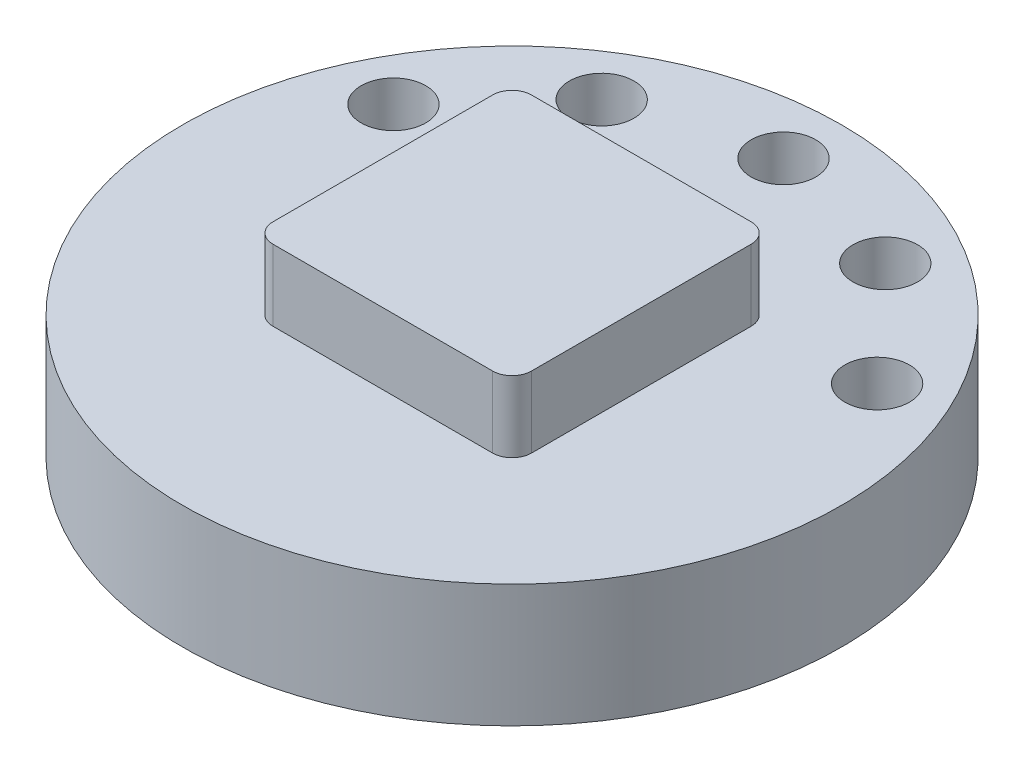
ISO-10303-21;
HEADER;
FILE_DESCRIPTION(('STEP AP214'),'2;1');
FILE_NAME('part.step','',(''),(''),'','','');
FILE_SCHEMA(('AUTOMOTIVE_DESIGN { 1 0 10303 214 1 1 1 1 }'));
ENDSEC;
DATA;
#1=APPLICATION_CONTEXT('core data for automotive mechanical design processes');
#2=APPLICATION_PROTOCOL_DEFINITION('international standard','automotive_design',2000,#1);
#3=PRODUCT_CONTEXT('',#1,'mechanical');
#4=PRODUCT('Part','Part','',(#3));
#5=PRODUCT_RELATED_PRODUCT_CATEGORY('part','',(#4));
#6=PRODUCT_DEFINITION_FORMATION('','',#4);
#7=PRODUCT_DEFINITION_CONTEXT('part definition',#1,'design');
#8=PRODUCT_DEFINITION('design','',#6,#7);
#9=PRODUCT_DEFINITION_SHAPE('','',#8);
#10=(LENGTH_UNIT() NAMED_UNIT(*) SI_UNIT(.MILLI.,.METRE.));
#11=(NAMED_UNIT(*) PLANE_ANGLE_UNIT() SI_UNIT($,.RADIAN.));
#12=(NAMED_UNIT(*) SI_UNIT($,.STERADIAN.) SOLID_ANGLE_UNIT());
#13=UNCERTAINTY_MEASURE_WITH_UNIT(LENGTH_MEASURE(1.E-05),#10,'distance_accuracy_value','');
#14=(GEOMETRIC_REPRESENTATION_CONTEXT(3) GLOBAL_UNCERTAINTY_ASSIGNED_CONTEXT((#13)) GLOBAL_UNIT_ASSIGNED_CONTEXT((#10,
#11,#12)) REPRESENTATION_CONTEXT('',''));
#15=CARTESIAN_POINT('',(0.,0.,0.));
#16=DIRECTION('',(0.,0.,1.));
#17=DIRECTION('',(1.,0.,0.));
#18=AXIS2_PLACEMENT_3D('',#15,#16,#17);
#19=CARTESIAN_POINT('',(0.,1.9,0.));
#20=DIRECTION('',(0.,1.,0.));
#21=DIRECTION('',(0.,0.,1.));
#22=AXIS2_PLACEMENT_3D('',#19,#20,#21);
#23=PLANE('',#22);
#24=CARTESIAN_POINT('',(-3.74222740159116,1.9,-1.90676009890607));
#25=DIRECTION('',(0.,1.,0.));
#26=DIRECTION('',(0.,0.,-1.));
#27=AXIS2_PLACEMENT_3D('',#24,#25,#26);
#28=CIRCLE('',#27,0.5);
#29=CARTESIAN_POINT('',(-3.74222740159116,1.9,-2.40676009890607));
#30=VERTEX_POINT('',#29);
#31=EDGE_CURVE('E139',#30,#30,#28,.T.);
#32=ORIENTED_EDGE('',*,*,#31,.F.);
#33=EDGE_LOOP('',(#32));
#34=FACE_BOUND('',#33,.T.);
#35=CARTESIAN_POINT('',(2.194493971807,1.9,-3.58108869028718));
#36=DIRECTION('',(0.,1.,0.));
#37=DIRECTION('',(0.,0.,1.));
#38=AXIS2_PLACEMENT_3D('',#35,#36,#37);
#39=CIRCLE('',#38,0.5);
#40=CARTESIAN_POINT('',(2.194493971807,1.9,-3.08108869028718));
#41=VERTEX_POINT('',#40);
#42=EDGE_CURVE('E151',#41,#41,#39,.T.);
#43=ORIENTED_EDGE('',*,*,#42,.F.);
#44=EDGE_LOOP('',(#43));
#45=FACE_BOUND('',#44,.T.);
#46=CARTESIAN_POINT('',(0.,1.9,0.));
#47=DIRECTION('',(0.,1.,0.));
#48=DIRECTION('',(0.,0.,1.));
#49=AXIS2_PLACEMENT_3D('',#46,#47,#48);
#50=CIRCLE('',#49,5.1);
#51=CARTESIAN_POINT('',(0.,1.9,-5.1));
#52=VERTEX_POINT('',#51);
#53=EDGE_CURVE('E163',#52,#52,#50,.T.);
#54=ORIENTED_EDGE('',*,*,#53,.T.);
#55=EDGE_LOOP('',(#54));
#56=FACE_BOUND('',#55,.T.);
#57=CARTESIAN_POINT('',(0.,1.9,-4.2));
#58=DIRECTION('',(0.,1.,0.));
#59=DIRECTION('',(0.,0.,1.));
#60=AXIS2_PLACEMENT_3D('',#57,#58,#59);
#61=CIRCLE('',#60,0.5);
#62=CARTESIAN_POINT('',(0.,1.9,-3.7));
#63=VERTEX_POINT('',#62);
#64=EDGE_CURVE('E157',#63,#63,#61,.T.);
#65=ORIENTED_EDGE('',*,*,#64,.F.);
#66=EDGE_LOOP('',(#65));
#67=FACE_BOUND('',#66,.T.);
#68=CARTESIAN_POINT('',(3.74222740159116,1.9,-1.90676009890607));
#69=DIRECTION('',(0.,1.,0.));
#70=DIRECTION('',(0.,0.,1.));
#71=AXIS2_PLACEMENT_3D('',#68,#69,#70);
#72=CIRCLE('',#71,0.5);
#73=CARTESIAN_POINT('',(3.74222740159116,1.9,-1.40676009890607));
#74=VERTEX_POINT('',#73);
#75=EDGE_CURVE('E145',#74,#74,#72,.T.);
#76=ORIENTED_EDGE('',*,*,#75,.F.);
#77=EDGE_LOOP('',(#76));
#78=FACE_BOUND('',#77,.T.);
#79=CARTESIAN_POINT('',(-2.194493971807,1.9,-3.58108869028718));
#80=DIRECTION('',(0.,1.,0.));
#81=DIRECTION('',(0.,0.,-1.));
#82=AXIS2_PLACEMENT_3D('',#79,#80,#81);
#83=CIRCLE('',#82,0.5);
#84=CARTESIAN_POINT('',(-2.194493971807,1.9,-4.08108869028718));
#85=VERTEX_POINT('',#84);
#86=EDGE_CURVE('E132',#85,#85,#83,.T.);
#87=ORIENTED_EDGE('',*,*,#86,.F.);
#88=EDGE_LOOP('',(#87));
#89=FACE_BOUND('',#88,.T.);
#90=DIRECTION('',(-1.,0.,0.));
#91=VECTOR('',#90,1.);
#92=CARTESIAN_POINT('',(-2.,1.9,-2.));
#93=LINE('',#92,#91);
#94=CARTESIAN_POINT('',(1.7,1.9,-2.));
#95=VERTEX_POINT('',#94);
#96=CARTESIAN_POINT('',(-1.7,1.9,-2.));
#97=VERTEX_POINT('',#96);
#98=EDGE_CURVE('E128',#95,#97,#93,.T.);
#99=ORIENTED_EDGE('',*,*,#98,.F.);
#100=CARTESIAN_POINT('',(1.7,1.9,-1.7));
#101=DIRECTION('',(0.,1.,0.));
#102=DIRECTION('',(0.,0.,1.));
#103=AXIS2_PLACEMENT_3D('',#100,#101,#102);
#104=CIRCLE('',#103,0.3);
#105=CARTESIAN_POINT('',(2.,1.9,-1.7));
#106=VERTEX_POINT('',#105);
#107=EDGE_CURVE('E43',#95,#106,#104,.F.);
#108=ORIENTED_EDGE('',*,*,#107,.T.);
#109=DIRECTION('',(0.,0.,-1.));
#110=VECTOR('',#109,1.);
#111=CARTESIAN_POINT('',(2.,1.9,2.));
#112=LINE('',#111,#110);
#113=CARTESIAN_POINT('',(2.,1.9,1.7));
#114=VERTEX_POINT('',#113);
#115=EDGE_CURVE('E189',#114,#106,#112,.T.);
#116=ORIENTED_EDGE('',*,*,#115,.F.);
#117=CARTESIAN_POINT('',(1.7,1.9,1.7));
#118=DIRECTION('',(0.,1.,0.));
#119=DIRECTION('',(0.,0.,1.));
#120=AXIS2_PLACEMENT_3D('',#117,#118,#119);
#121=CIRCLE('',#120,0.3);
#122=CARTESIAN_POINT('',(1.7,1.9,2.));
#123=VERTEX_POINT('',#122);
#124=EDGE_CURVE('E107',#114,#123,#121,.F.);
#125=ORIENTED_EDGE('',*,*,#124,.T.);
#126=DIRECTION('',(1.,0.,0.));
#127=VECTOR('',#126,1.);
#128=CARTESIAN_POINT('',(-2.,1.9,2.));
#129=LINE('',#128,#127);
#130=CARTESIAN_POINT('',(-1.7,1.9,2.));
#131=VERTEX_POINT('',#130);
#132=EDGE_CURVE('E114',#131,#123,#129,.T.);
#133=ORIENTED_EDGE('',*,*,#132,.F.);
#134=CARTESIAN_POINT('',(-1.7,1.9,1.7));
#135=DIRECTION('',(0.,1.,0.));
#136=DIRECTION('',(0.,0.,1.));
#137=AXIS2_PLACEMENT_3D('',#134,#135,#136);
#138=CIRCLE('',#137,0.3);
#139=CARTESIAN_POINT('',(-2.,1.9,1.7));
#140=VERTEX_POINT('',#139);
#141=EDGE_CURVE('E99',#131,#140,#138,.F.);
#142=ORIENTED_EDGE('',*,*,#141,.T.);
#143=DIRECTION('',(0.,0.,1.));
#144=VECTOR('',#143,1.);
#145=CARTESIAN_POINT('',(-2.,1.9,2.));
#146=LINE('',#145,#144);
#147=CARTESIAN_POINT('',(-2.,1.9,-1.7));
#148=VERTEX_POINT('',#147);
#149=EDGE_CURVE('E123',#148,#140,#146,.T.);
#150=ORIENTED_EDGE('',*,*,#149,.F.);
#151=CARTESIAN_POINT('',(-1.7,1.9,-1.7));
#152=DIRECTION('',(0.,1.,0.));
#153=DIRECTION('',(0.,0.,1.));
#154=AXIS2_PLACEMENT_3D('',#151,#152,#153);
#155=CIRCLE('',#154,0.3);
#156=EDGE_CURVE('E11',#148,#97,#155,.F.);
#157=ORIENTED_EDGE('',*,*,#156,.T.);
#158=EDGE_LOOP('',(#99,#108,#116,#125,#133,#142,#150,#157));
#159=FACE_BOUND('',#158,.T.);
#160=ADVANCED_FACE('F35',(#34,#45,#56,#67,#78,#89,#159),#23,.T.);
#161=CARTESIAN_POINT('',(0.,0.,0.));
#162=DIRECTION('',(0.,1.,0.));
#163=DIRECTION('',(0.,0.,1.));
#164=AXIS2_PLACEMENT_3D('',#161,#162,#163);
#165=PLANE('',#164);
#166=CARTESIAN_POINT('',(0.,0.,0.));
#167=DIRECTION('',(0.,1.,0.));
#168=DIRECTION('',(0.,0.,1.));
#169=AXIS2_PLACEMENT_3D('',#166,#167,#168);
#170=CIRCLE('',#169,5.1);
#171=CARTESIAN_POINT('',(0.,0.,-5.1));
#172=VERTEX_POINT('',#171);
#173=EDGE_CURVE('E160',#172,#172,#170,.T.);
#174=ORIENTED_EDGE('',*,*,#173,.F.);
#175=EDGE_LOOP('',(#174));
#176=FACE_BOUND('',#175,.T.);
#177=CARTESIAN_POINT('',(0.,0.,-4.2));
#178=DIRECTION('',(0.,1.,0.));
#179=DIRECTION('',(0.,0.,1.));
#180=AXIS2_PLACEMENT_3D('',#177,#178,#179);
#181=CIRCLE('',#180,0.5);
#182=CARTESIAN_POINT('',(0.,0.,-3.7));
#183=VERTEX_POINT('',#182);
#184=EDGE_CURVE('E154',#183,#183,#181,.T.);
#185=ORIENTED_EDGE('',*,*,#184,.T.);
#186=EDGE_LOOP('',(#185));
#187=FACE_BOUND('',#186,.T.);
#188=CARTESIAN_POINT('',(2.194493971807,0.,-3.58108869028718));
#189=DIRECTION('',(0.,1.,0.));
#190=DIRECTION('',(0.,0.,1.));
#191=AXIS2_PLACEMENT_3D('',#188,#189,#190);
#192=CIRCLE('',#191,0.5);
#193=CARTESIAN_POINT('',(2.194493971807,0.,-3.08108869028718));
#194=VERTEX_POINT('',#193);
#195=EDGE_CURVE('E148',#194,#194,#192,.T.);
#196=ORIENTED_EDGE('',*,*,#195,.T.);
#197=EDGE_LOOP('',(#196));
#198=FACE_BOUND('',#197,.T.);
#199=CARTESIAN_POINT('',(3.74222740159116,0.,-1.90676009890607));
#200=DIRECTION('',(0.,1.,0.));
#201=DIRECTION('',(0.,0.,1.));
#202=AXIS2_PLACEMENT_3D('',#199,#200,#201);
#203=CIRCLE('',#202,0.5);
#204=CARTESIAN_POINT('',(3.74222740159116,0.,-1.40676009890607));
#205=VERTEX_POINT('',#204);
#206=EDGE_CURVE('E142',#205,#205,#203,.T.);
#207=ORIENTED_EDGE('',*,*,#206,.T.);
#208=EDGE_LOOP('',(#207));
#209=FACE_BOUND('',#208,.T.);
#210=CARTESIAN_POINT('',(-3.74222740159116,0.,-1.90676009890607));
#211=DIRECTION('',(0.,1.,0.));
#212=DIRECTION('',(0.,0.,-1.));
#213=AXIS2_PLACEMENT_3D('',#210,#211,#212);
#214=CIRCLE('',#213,0.5);
#215=CARTESIAN_POINT('',(-3.74222740159116,0.,-2.40676009890607));
#216=VERTEX_POINT('',#215);
#217=EDGE_CURVE('E135',#216,#216,#214,.T.);
#218=ORIENTED_EDGE('',*,*,#217,.T.);
#219=EDGE_LOOP('',(#218));
#220=FACE_BOUND('',#219,.T.);
#221=CARTESIAN_POINT('',(-2.194493971807,0.,-3.58108869028718));
#222=DIRECTION('',(0.,1.,0.));
#223=DIRECTION('',(0.,0.,-1.));
#224=AXIS2_PLACEMENT_3D('',#221,#222,#223);
#225=CIRCLE('',#224,0.5);
#226=CARTESIAN_POINT('',(-2.194493971807,0.,-4.08108869028718));
#227=VERTEX_POINT('',#226);
#228=EDGE_CURVE('E136',#227,#227,#225,.T.);
#229=ORIENTED_EDGE('',*,*,#228,.T.);
#230=EDGE_LOOP('',(#229));
#231=FACE_BOUND('',#230,.T.);
#232=ADVANCED_FACE('F224',(#176,#187,#198,#209,#220,#231),#165,.F.);
#233=CARTESIAN_POINT('',(0.,1.9,0.));
#234=DIRECTION('',(0.,-1.,0.));
#235=DIRECTION('',(0.,0.,-1.));
#236=AXIS2_PLACEMENT_3D('',#233,#234,#235);
#237=CYLINDRICAL_SURFACE('',#236,5.1);
#238=CARTESIAN_POINT('',(0.,1.9,-5.1));
#239=CARTESIAN_POINT('',(0.,1.88020833333333,-5.1));
#240=CARTESIAN_POINT('',(0.,1.86041666666667,-5.1));
#241=CARTESIAN_POINT('',(0.,1.82083333333333,-5.1));
#242=CARTESIAN_POINT('',(0.,1.80104166666667,-5.1));
#243=CARTESIAN_POINT('',(0.,1.76145833333333,-5.1));
#244=CARTESIAN_POINT('',(0.,1.74166666666667,-5.1));
#245=CARTESIAN_POINT('',(0.,1.70208333333333,-5.1));
#246=CARTESIAN_POINT('',(0.,1.68229166666667,-5.1));
#247=CARTESIAN_POINT('',(0.,1.64270833333333,-5.1));
#248=CARTESIAN_POINT('',(0.,1.62291666666667,-5.1));
#249=CARTESIAN_POINT('',(0.,1.58333333333333,-5.1));
#250=CARTESIAN_POINT('',(0.,1.56354166666667,-5.1));
#251=CARTESIAN_POINT('',(0.,1.52395833333333,-5.1));
#252=CARTESIAN_POINT('',(0.,1.50416666666667,-5.1));
#253=CARTESIAN_POINT('',(0.,1.46458333333333,-5.1));
#254=CARTESIAN_POINT('',(0.,1.44479166666667,-5.1));
#255=CARTESIAN_POINT('',(0.,1.40520833333333,-5.1));
#256=CARTESIAN_POINT('',(0.,1.38541666666667,-5.1));
#257=CARTESIAN_POINT('',(0.,1.34583333333333,-5.1));
#258=CARTESIAN_POINT('',(0.,1.32604166666667,-5.1));
#259=CARTESIAN_POINT('',(0.,1.28645833333333,-5.1));
#260=CARTESIAN_POINT('',(0.,1.26666666666667,-5.1));
#261=CARTESIAN_POINT('',(0.,1.22708333333333,-5.1));
#262=CARTESIAN_POINT('',(0.,1.20729166666667,-5.1));
#263=CARTESIAN_POINT('',(0.,1.16770833333333,-5.1));
#264=CARTESIAN_POINT('',(0.,1.14791666666667,-5.1));
#265=CARTESIAN_POINT('',(0.,1.10833333333333,-5.1));
#266=CARTESIAN_POINT('',(0.,1.08854166666667,-5.1));
#267=CARTESIAN_POINT('',(0.,1.04895833333333,-5.1));
#268=CARTESIAN_POINT('',(0.,1.02916666666667,-5.1));
#269=CARTESIAN_POINT('',(0.,0.989583333333333,-5.1));
#270=CARTESIAN_POINT('',(0.,0.969791666666666,-5.1));
#271=CARTESIAN_POINT('',(0.,0.930208333333333,-5.1));
#272=CARTESIAN_POINT('',(0.,0.910416666666667,-5.1));
#273=CARTESIAN_POINT('',(0.,0.870833333333333,-5.1));
#274=CARTESIAN_POINT('',(0.,0.851041666666667,-5.1));
#275=CARTESIAN_POINT('',(0.,0.811458333333333,-5.1));
#276=CARTESIAN_POINT('',(0.,0.791666666666667,-5.1));
#277=CARTESIAN_POINT('',(0.,0.752083333333333,-5.1));
#278=CARTESIAN_POINT('',(0.,0.732291666666667,-5.1));
#279=CARTESIAN_POINT('',(0.,0.692708333333333,-5.1));
#280=CARTESIAN_POINT('',(0.,0.672916666666667,-5.1));
#281=CARTESIAN_POINT('',(0.,0.633333333333333,-5.1));
#282=CARTESIAN_POINT('',(0.,0.613541666666667,-5.1));
#283=CARTESIAN_POINT('',(0.,0.573958333333333,-5.1));
#284=CARTESIAN_POINT('',(0.,0.554166666666667,-5.1));
#285=CARTESIAN_POINT('',(0.,0.514583333333334,-5.1));
#286=CARTESIAN_POINT('',(0.,0.494791666666667,-5.1));
#287=CARTESIAN_POINT('',(0.,0.455208333333333,-5.1));
#288=CARTESIAN_POINT('',(0.,0.435416666666667,-5.1));
#289=CARTESIAN_POINT('',(0.,0.395833333333333,-5.1));
#290=CARTESIAN_POINT('',(0.,0.376041666666667,-5.1));
#291=CARTESIAN_POINT('',(0.,0.336458333333333,-5.1));
#292=CARTESIAN_POINT('',(0.,0.316666666666667,-5.1));
#293=CARTESIAN_POINT('',(0.,0.277083333333333,-5.1));
#294=CARTESIAN_POINT('',(0.,0.257291666666667,-5.1));
#295=CARTESIAN_POINT('',(0.,0.217708333333333,-5.1));
#296=CARTESIAN_POINT('',(0.,0.197916666666667,-5.1));
#297=CARTESIAN_POINT('',(0.,0.158333333333333,-5.1));
#298=CARTESIAN_POINT('',(0.,0.138541666666667,-5.1));
#299=CARTESIAN_POINT('',(0.,0.0989583333333333,-5.1));
#300=CARTESIAN_POINT('',(0.,0.0791666666666666,-5.1));
#301=CARTESIAN_POINT('',(0.,0.0395833333333333,-5.1));
#302=CARTESIAN_POINT('',(0.,0.0197916666666666,-5.1));
#303=CARTESIAN_POINT('',(0.,0.,-5.1));
#304=B_SPLINE_CURVE_WITH_KNOTS('',3,(#238,#239,#240,#241,#242,#243,#244,#245,#246,#247,#248,
#249,#250,#251,#252,#253,#254,#255,#256,#257,#258,#259,#260,#261,#262,#263,#264,#265,#266,#267,
#268,#269,#270,#271,#272,#273,#274,#275,#276,#277,#278,#279,#280,#281,#282,#283,#284,#285,#286,
#287,#288,#289,#290,#291,#292,#293,#294,#295,#296,#297,#298,#299,#300,#301,#302,#303),
.UNSPECIFIED.,.F.,.F.,(4,2,2,2,2,2,2,2,2,2,2,2,2,2,2,2,2,2,2,2,2,2,2,2,2,2,2,2,2,2,2,2,4),(0.,
0.0593750000000002,0.11875,0.178125,0.2375,0.296875,0.35625,0.415625,0.475,0.534375,0.59375,
0.653125,0.7125,0.771875,0.83125,0.890625,0.95,1.009375,1.06875,1.128125,1.1875,1.246875,
1.30625,1.365625,1.425,1.484375,1.54375,1.603125,1.6625,1.721875,1.78125,1.840625,1.9),.UNSPECIFIED.);
#305=EDGE_CURVE('BSEAM230',#52,#172,#304,.T.);
#306=ORIENTED_EDGE('',*,*,#53,.F.);
#307=ORIENTED_EDGE('',*,*,#173,.T.);
#308=ORIENTED_EDGE('',*,*,#305,.T.);
#309=ORIENTED_EDGE('',*,*,#305,.F.);
#310=EDGE_LOOP('',(#306,#308,#307,#309));
#311=FACE_BOUND('',#310,.T.);
#312=ADVANCED_FACE('F230',(#311),#237,.T.);
#313=CARTESIAN_POINT('',(0.,1.9,-4.2));
#314=DIRECTION('',(0.,-1.,0.));
#315=DIRECTION('',(0.,0.,-1.));
#316=AXIS2_PLACEMENT_3D('',#313,#314,#315);
#317=CYLINDRICAL_SURFACE('',#316,0.5);
#318=ORIENTED_EDGE('',*,*,#64,.T.);
#319=EDGE_LOOP('',(#318));
#320=FACE_BOUND('',#319,.T.);
#321=ORIENTED_EDGE('',*,*,#184,.F.);
#322=EDGE_LOOP('',(#321));
#323=FACE_BOUND('',#322,.T.);
#324=ADVANCED_FACE('F236',(#320,#323),#317,.F.);
#325=CARTESIAN_POINT('',(2.194493971807,1.9,-3.58108869028718));
#326=DIRECTION('',(0.,-1.,0.));
#327=DIRECTION('',(0.,0.,-1.));
#328=AXIS2_PLACEMENT_3D('',#325,#326,#327);
#329=CYLINDRICAL_SURFACE('',#328,0.5);
#330=ORIENTED_EDGE('',*,*,#42,.T.);
#331=EDGE_LOOP('',(#330));
#332=FACE_BOUND('',#331,.T.);
#333=ORIENTED_EDGE('',*,*,#195,.F.);
#334=EDGE_LOOP('',(#333));
#335=FACE_BOUND('',#334,.T.);
#336=ADVANCED_FACE('F336',(#332,#335),#329,.F.);
#337=CARTESIAN_POINT('',(3.74222740159116,1.9,-1.90676009890607));
#338=DIRECTION('',(0.,-1.,0.));
#339=DIRECTION('',(0.,0.,-1.));
#340=AXIS2_PLACEMENT_3D('',#337,#338,#339);
#341=CYLINDRICAL_SURFACE('',#340,0.5);
#342=ORIENTED_EDGE('',*,*,#75,.T.);
#343=EDGE_LOOP('',(#342));
#344=FACE_BOUND('',#343,.T.);
#345=ORIENTED_EDGE('',*,*,#206,.F.);
#346=EDGE_LOOP('',(#345));
#347=FACE_BOUND('',#346,.T.);
#348=ADVANCED_FACE('F326',(#344,#347),#341,.F.);
#349=CARTESIAN_POINT('',(-3.74222740159116,1.9,-1.90676009890607));
#350=DIRECTION('',(0.,-1.,0.));
#351=DIRECTION('',(0.,0.,-1.));
#352=AXIS2_PLACEMENT_3D('',#349,#350,#351);
#353=CYLINDRICAL_SURFACE('',#352,0.5);
#354=ORIENTED_EDGE('',*,*,#31,.T.);
#355=EDGE_LOOP('',(#354));
#356=FACE_BOUND('',#355,.T.);
#357=ORIENTED_EDGE('',*,*,#217,.F.);
#358=EDGE_LOOP('',(#357));
#359=FACE_BOUND('',#358,.T.);
#360=ADVANCED_FACE('F316',(#356,#359),#353,.F.);
#361=CARTESIAN_POINT('',(-2.194493971807,1.9,-3.58108869028718));
#362=DIRECTION('',(0.,-1.,0.));
#363=DIRECTION('',(0.,0.,-1.));
#364=AXIS2_PLACEMENT_3D('',#361,#362,#363);
#365=CYLINDRICAL_SURFACE('',#364,0.5);
#366=ORIENTED_EDGE('',*,*,#86,.T.);
#367=EDGE_LOOP('',(#366));
#368=FACE_BOUND('',#367,.T.);
#369=ORIENTED_EDGE('',*,*,#228,.F.);
#370=EDGE_LOOP('',(#369));
#371=FACE_BOUND('',#370,.T.);
#372=ADVANCED_FACE('F302',(#368,#371),#365,.F.);
#373=CARTESIAN_POINT('',(2.,3.,2.));
#374=DIRECTION('',(-1.,0.,0.));
#375=DIRECTION('',(0.,0.,1.));
#376=AXIS2_PLACEMENT_3D('',#373,#374,#375);
#377=PLANE('',#376);
#378=DIRECTION('',(0.,0.,-1.));
#379=VECTOR('',#378,1.);
#380=CARTESIAN_POINT('',(2.,3.,2.));
#381=LINE('',#380,#379);
#382=CARTESIAN_POINT('',(2.,3.,1.7));
#383=VERTEX_POINT('',#382);
#384=CARTESIAN_POINT('',(2.,3.,-1.7));
#385=VERTEX_POINT('',#384);
#386=EDGE_CURVE('E122',#383,#385,#381,.T.);
#387=ORIENTED_EDGE('',*,*,#386,.F.);
#388=DIRECTION('',(0.,-1.,0.));
#389=VECTOR('',#388,1.);
#390=CARTESIAN_POINT('',(2.,3.,1.7));
#391=LINE('',#390,#389);
#392=EDGE_CURVE('E182',#383,#114,#391,.T.);
#393=ORIENTED_EDGE('',*,*,#392,.T.);
#394=ORIENTED_EDGE('',*,*,#115,.T.);
#395=DIRECTION('',(0.,-1.,0.));
#396=VECTOR('',#395,1.);
#397=CARTESIAN_POINT('',(2.,3.,-1.7));
#398=LINE('',#397,#396);
#399=EDGE_CURVE('E180',#106,#385,#398,.F.);
#400=ORIENTED_EDGE('',*,*,#399,.T.);
#401=EDGE_LOOP('',(#387,#393,#394,#400));
#402=FACE_BOUND('',#401,.T.);
#403=ADVANCED_FACE('F192',(#402),#377,.F.);
#404=CARTESIAN_POINT('',(-2.,3.,-2.));
#405=DIRECTION('',(0.,0.,1.));
#406=DIRECTION('',(1.,0.,0.));
#407=AXIS2_PLACEMENT_3D('',#404,#405,#406);
#408=PLANE('',#407);
#409=DIRECTION('',(-1.,0.,0.));
#410=VECTOR('',#409,1.);
#411=CARTESIAN_POINT('',(-2.,3.,-2.));
#412=LINE('',#411,#410);
#413=CARTESIAN_POINT('',(1.7,3.,-2.));
#414=VERTEX_POINT('',#413);
#415=CARTESIAN_POINT('',(-1.7,3.,-2.));
#416=VERTEX_POINT('',#415);
#417=EDGE_CURVE('E126',#414,#416,#412,.T.);
#418=ORIENTED_EDGE('',*,*,#417,.F.);
#419=DIRECTION('',(0.,-1.,0.));
#420=VECTOR('',#419,1.);
#421=CARTESIAN_POINT('',(1.7,3.,-2.));
#422=LINE('',#421,#420);
#423=EDGE_CURVE('E108',#414,#95,#422,.T.);
#424=ORIENTED_EDGE('',*,*,#423,.T.);
#425=ORIENTED_EDGE('',*,*,#98,.T.);
#426=DIRECTION('',(0.,-1.,0.));
#427=VECTOR('',#426,1.);
#428=CARTESIAN_POINT('',(-1.7,3.,-2.));
#429=LINE('',#428,#427);
#430=EDGE_CURVE('E185',#97,#416,#429,.F.);
#431=ORIENTED_EDGE('',*,*,#430,.T.);
#432=EDGE_LOOP('',(#418,#424,#425,#431));
#433=FACE_BOUND('',#432,.T.);
#434=ADVANCED_FACE('F204',(#433),#408,.F.);
#435=CARTESIAN_POINT('',(-2.,3.,2.));
#436=DIRECTION('',(1.,0.,0.));
#437=DIRECTION('',(0.,0.,-1.));
#438=AXIS2_PLACEMENT_3D('',#435,#436,#437);
#439=PLANE('',#438);
#440=ORIENTED_EDGE('',*,*,#149,.T.);
#441=DIRECTION('',(0.,-1.,0.));
#442=VECTOR('',#441,1.);
#443=CARTESIAN_POINT('',(-2.,3.,1.7));
#444=LINE('',#443,#442);
#445=CARTESIAN_POINT('',(-2.,3.,1.7));
#446=VERTEX_POINT('',#445);
#447=EDGE_CURVE('E104',#140,#446,#444,.F.);
#448=ORIENTED_EDGE('',*,*,#447,.T.);
#449=DIRECTION('',(0.,0.,1.));
#450=VECTOR('',#449,1.);
#451=CARTESIAN_POINT('',(-2.,3.,2.));
#452=LINE('',#451,#450);
#453=CARTESIAN_POINT('',(-2.,3.,-1.7));
#454=VERTEX_POINT('',#453);
#455=EDGE_CURVE('E206',#454,#446,#452,.T.);
#456=ORIENTED_EDGE('',*,*,#455,.F.);
#457=DIRECTION('',(0.,-1.,0.));
#458=VECTOR('',#457,1.);
#459=CARTESIAN_POINT('',(-2.,3.,-1.7));
#460=LINE('',#459,#458);
#461=EDGE_CURVE('E118',#454,#148,#460,.T.);
#462=ORIENTED_EDGE('',*,*,#461,.T.);
#463=EDGE_LOOP('',(#440,#448,#456,#462));
#464=FACE_BOUND('',#463,.T.);
#465=ADVANCED_FACE('F214',(#464),#439,.F.);
#466=CARTESIAN_POINT('',(-2.,3.,2.));
#467=DIRECTION('',(0.,0.,-1.));
#468=DIRECTION('',(-1.,0.,0.));
#469=AXIS2_PLACEMENT_3D('',#466,#467,#468);
#470=PLANE('',#469);
#471=DIRECTION('',(1.,0.,0.));
#472=VECTOR('',#471,1.);
#473=CARTESIAN_POINT('',(-2.,3.,2.));
#474=LINE('',#473,#472);
#475=CARTESIAN_POINT('',(-1.7,3.,2.));
#476=VERTEX_POINT('',#475);
#477=CARTESIAN_POINT('',(1.7,3.,2.));
#478=VERTEX_POINT('',#477);
#479=EDGE_CURVE('E117',#476,#478,#474,.T.);
#480=ORIENTED_EDGE('',*,*,#479,.F.);
#481=DIRECTION('',(0.,-1.,0.));
#482=VECTOR('',#481,1.);
#483=CARTESIAN_POINT('',(-1.7,3.,2.));
#484=LINE('',#483,#482);
#485=EDGE_CURVE('E103',#476,#131,#484,.T.);
#486=ORIENTED_EDGE('',*,*,#485,.T.);
#487=ORIENTED_EDGE('',*,*,#132,.T.);
#488=DIRECTION('',(0.,-1.,0.));
#489=VECTOR('',#488,1.);
#490=CARTESIAN_POINT('',(1.7,3.,2.));
#491=LINE('',#490,#489);
#492=EDGE_CURVE('E119',#123,#478,#491,.F.);
#493=ORIENTED_EDGE('',*,*,#492,.T.);
#494=EDGE_LOOP('',(#480,#486,#487,#493));
#495=FACE_BOUND('',#494,.T.);
#496=ADVANCED_FACE('F113',(#495),#470,.F.);
#497=CARTESIAN_POINT('',(0.,3.,0.));
#498=DIRECTION('',(0.,-1.,0.));
#499=DIRECTION('',(0.,0.,-1.));
#500=AXIS2_PLACEMENT_3D('',#497,#498,#499);
#501=PLANE('',#500);
#502=ORIENTED_EDGE('',*,*,#455,.T.);
#503=CARTESIAN_POINT('',(-1.7,3.,1.7));
#504=DIRECTION('',(0.,-1.,0.));
#505=DIRECTION('',(0.,0.,-1.));
#506=AXIS2_PLACEMENT_3D('',#503,#504,#505);
#507=CIRCLE('',#506,0.3);
#508=EDGE_CURVE('E178',#446,#476,#507,.F.);
#509=ORIENTED_EDGE('',*,*,#508,.T.);
#510=ORIENTED_EDGE('',*,*,#479,.T.);
#511=CARTESIAN_POINT('',(1.7,3.,1.7));
#512=DIRECTION('',(0.,-1.,0.));
#513=DIRECTION('',(0.,0.,-1.));
#514=AXIS2_PLACEMENT_3D('',#511,#512,#513);
#515=CIRCLE('',#514,0.3);
#516=EDGE_CURVE('E176',#478,#383,#515,.F.);
#517=ORIENTED_EDGE('',*,*,#516,.T.);
#518=ORIENTED_EDGE('',*,*,#386,.T.);
#519=CARTESIAN_POINT('',(1.7,3.,-1.7));
#520=DIRECTION('',(0.,-1.,0.));
#521=DIRECTION('',(0.,0.,-1.));
#522=AXIS2_PLACEMENT_3D('',#519,#520,#521);
#523=CIRCLE('',#522,0.3);
#524=EDGE_CURVE('E174',#385,#414,#523,.F.);
#525=ORIENTED_EDGE('',*,*,#524,.T.);
#526=ORIENTED_EDGE('',*,*,#417,.T.);
#527=CARTESIAN_POINT('',(-1.7,3.,-1.7));
#528=DIRECTION('',(0.,-1.,0.));
#529=DIRECTION('',(0.,0.,-1.));
#530=AXIS2_PLACEMENT_3D('',#527,#528,#529);
#531=CIRCLE('',#530,0.3);
#532=EDGE_CURVE('E172',#416,#454,#531,.F.);
#533=ORIENTED_EDGE('',*,*,#532,.T.);
#534=EDGE_LOOP('',(#502,#509,#510,#517,#518,#525,#526,#533));
#535=FACE_BOUND('',#534,.T.);
#536=ADVANCED_FACE('F201',(#535),#501,.F.);
#537=CARTESIAN_POINT('',(-1.7,3.,1.7));
#538=DIRECTION('',(0.,-1.,0.));
#539=DIRECTION('',(0.,0.,-1.));
#540=AXIS2_PLACEMENT_3D('',#537,#538,#539);
#541=CYLINDRICAL_SURFACE('',#540,0.3);
#542=ORIENTED_EDGE('',*,*,#508,.F.);
#543=ORIENTED_EDGE('',*,*,#447,.F.);
#544=ORIENTED_EDGE('',*,*,#141,.F.);
#545=ORIENTED_EDGE('',*,*,#485,.F.);
#546=EDGE_LOOP('',(#542,#543,#544,#545));
#547=FACE_BOUND('',#546,.T.);
#548=ADVANCED_FACE('F102',(#547),#541,.T.);
#549=CARTESIAN_POINT('',(1.7,3.,1.7));
#550=DIRECTION('',(0.,-1.,0.));
#551=DIRECTION('',(0.,0.,-1.));
#552=AXIS2_PLACEMENT_3D('',#549,#550,#551);
#553=CYLINDRICAL_SURFACE('',#552,0.3);
#554=ORIENTED_EDGE('',*,*,#516,.F.);
#555=ORIENTED_EDGE('',*,*,#492,.F.);
#556=ORIENTED_EDGE('',*,*,#124,.F.);
#557=ORIENTED_EDGE('',*,*,#392,.F.);
#558=EDGE_LOOP('',(#554,#555,#556,#557));
#559=FACE_BOUND('',#558,.T.);
#560=ADVANCED_FACE('F244',(#559),#553,.T.);
#561=CARTESIAN_POINT('',(1.7,3.,-1.7));
#562=DIRECTION('',(0.,-1.,0.));
#563=DIRECTION('',(0.,0.,-1.));
#564=AXIS2_PLACEMENT_3D('',#561,#562,#563);
#565=CYLINDRICAL_SURFACE('',#564,0.3);
#566=ORIENTED_EDGE('',*,*,#524,.F.);
#567=ORIENTED_EDGE('',*,*,#399,.F.);
#568=ORIENTED_EDGE('',*,*,#107,.F.);
#569=ORIENTED_EDGE('',*,*,#423,.F.);
#570=EDGE_LOOP('',(#566,#567,#568,#569));
#571=FACE_BOUND('',#570,.T.);
#572=ADVANCED_FACE('F196',(#571),#565,.T.);
#573=CARTESIAN_POINT('',(-1.7,3.,-1.7));
#574=DIRECTION('',(0.,-1.,0.));
#575=DIRECTION('',(0.,0.,-1.));
#576=AXIS2_PLACEMENT_3D('',#573,#574,#575);
#577=CYLINDRICAL_SURFACE('',#576,0.3);
#578=ORIENTED_EDGE('',*,*,#532,.F.);
#579=ORIENTED_EDGE('',*,*,#430,.F.);
#580=ORIENTED_EDGE('',*,*,#156,.F.);
#581=ORIENTED_EDGE('',*,*,#461,.F.);
#582=EDGE_LOOP('',(#578,#579,#580,#581));
#583=FACE_BOUND('',#582,.T.);
#584=ADVANCED_FACE('F37',(#583),#577,.T.);
#585=CLOSED_SHELL('',(#160,#232,#312,#324,#336,#348,#360,#372,#403,#434,#465,#496,#536,#548,
#560,#572,#584));
#586=MANIFOLD_SOLID_BREP('B2',#585);
#587=ADVANCED_BREP_SHAPE_REPRESENTATION('',(#18,#586),#14);
#588=SHAPE_DEFINITION_REPRESENTATION(#9,#587);
ENDSEC;
END-ISO-10303-21;
